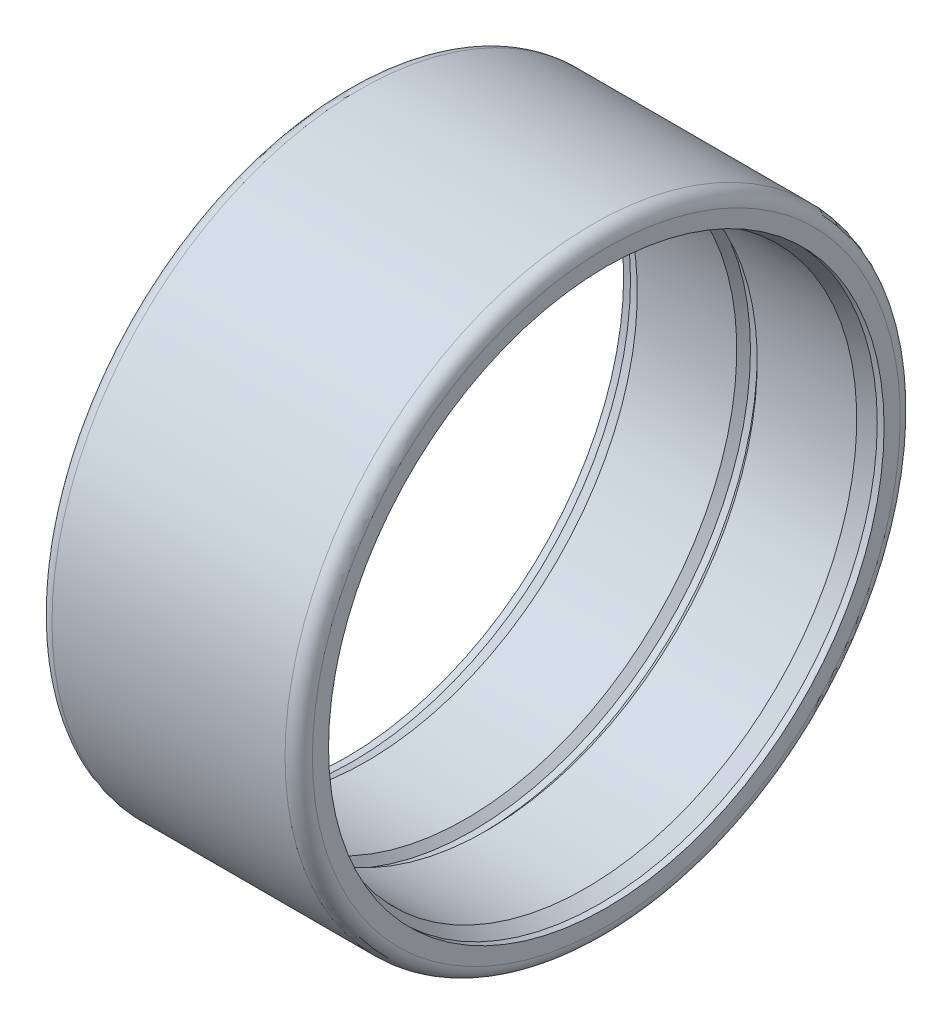
ISO-10303-21;
HEADER;
FILE_DESCRIPTION(('STEP AP214'),'2;1');
FILE_NAME('part.step','',(''),(''),'','','');
FILE_SCHEMA(('AUTOMOTIVE_DESIGN { 1 0 10303 214 1 1 1 1 }'));
ENDSEC;
DATA;
#1=APPLICATION_CONTEXT('core data for automotive mechanical design processes');
#2=APPLICATION_PROTOCOL_DEFINITION('international standard','automotive_design',2000,#1);
#3=PRODUCT_CONTEXT('',#1,'mechanical');
#4=PRODUCT('Part','Part','',(#3));
#5=PRODUCT_RELATED_PRODUCT_CATEGORY('part','',(#4));
#6=PRODUCT_DEFINITION_FORMATION('','',#4);
#7=PRODUCT_DEFINITION_CONTEXT('part definition',#1,'design');
#8=PRODUCT_DEFINITION('design','',#6,#7);
#9=PRODUCT_DEFINITION_SHAPE('','',#8);
#10=(LENGTH_UNIT() NAMED_UNIT(*) SI_UNIT(.MILLI.,.METRE.));
#11=(NAMED_UNIT(*) PLANE_ANGLE_UNIT() SI_UNIT($,.RADIAN.));
#12=(NAMED_UNIT(*) SI_UNIT($,.STERADIAN.) SOLID_ANGLE_UNIT());
#13=UNCERTAINTY_MEASURE_WITH_UNIT(LENGTH_MEASURE(1.E-05),#10,'distance_accuracy_value','');
#14=(GEOMETRIC_REPRESENTATION_CONTEXT(3) GLOBAL_UNCERTAINTY_ASSIGNED_CONTEXT((#13)) GLOBAL_UNIT_ASSIGNED_CONTEXT((#10,
#11,#12)) REPRESENTATION_CONTEXT('',''));
#15=CARTESIAN_POINT('',(0.,0.,0.));
#16=DIRECTION('',(0.,0.,1.));
#17=DIRECTION('',(1.,0.,0.));
#18=AXIS2_PLACEMENT_3D('',#15,#16,#17);
#19=CARTESIAN_POINT('',(-7.5,0.,0.));
#20=DIRECTION('',(1.,0.,0.));
#21=DIRECTION('',(0.,0.,-1.));
#22=AXIS2_PLACEMENT_3D('',#19,#20,#21);
#23=CONICAL_SURFACE('',#22,198.2,0.785398163397451);
#24=CARTESIAN_POINT('',(-2.5,0.,0.));
#25=DIRECTION('',(-1.,0.,0.));
#26=DIRECTION('',(0.,0.,1.));
#27=AXIS2_PLACEMENT_3D('',#24,#25,#26);
#28=CIRCLE('',#27,203.2);
#29=CARTESIAN_POINT('',(-2.5,0.,203.2));
#30=VERTEX_POINT('',#29);
#31=EDGE_CURVE('E51',#30,#30,#28,.T.);
#32=ORIENTED_EDGE('',*,*,#31,.F.);
#33=EDGE_LOOP('',(#32));
#34=FACE_BOUND('',#33,.T.);
#35=CARTESIAN_POINT('',(-7.5,0.,0.));
#36=DIRECTION('',(-1.,0.,0.));
#37=DIRECTION('',(0.,0.,1.));
#38=AXIS2_PLACEMENT_3D('',#35,#36,#37);
#39=CIRCLE('',#38,198.2);
#40=CARTESIAN_POINT('',(-7.5,0.,198.2));
#41=VERTEX_POINT('',#40);
#42=EDGE_CURVE('E78',#41,#41,#39,.T.);
#43=ORIENTED_EDGE('',*,*,#42,.T.);
#44=EDGE_LOOP('',(#43));
#45=FACE_BOUND('',#44,.T.);
#46=ADVANCED_FACE('F31',(#34,#45),#23,.F.);
#47=CARTESIAN_POINT('',(-32.3713117610305,0.,0.));
#48=DIRECTION('',(-1.,0.,0.));
#49=DIRECTION('',(0.,0.,1.));
#50=AXIS2_PLACEMENT_3D('',#47,#48,#49);
#51=CYLINDRICAL_SURFACE('',#50,203.2);
#52=CARTESIAN_POINT('',(2.5,0.,0.));
#53=DIRECTION('',(-1.,0.,0.));
#54=DIRECTION('',(0.,0.,1.));
#55=AXIS2_PLACEMENT_3D('',#52,#53,#54);
#56=CIRCLE('',#55,203.2);
#57=CARTESIAN_POINT('',(2.5,0.,203.2));
#58=VERTEX_POINT('',#57);
#59=EDGE_CURVE('E54',#58,#58,#56,.T.);
#60=ORIENTED_EDGE('',*,*,#59,.F.);
#61=EDGE_LOOP('',(#60));
#62=FACE_BOUND('',#61,.T.);
#63=ORIENTED_EDGE('',*,*,#31,.T.);
#64=EDGE_LOOP('',(#63));
#65=FACE_BOUND('',#64,.T.);
#66=ADVANCED_FACE('F113',(#62,#65),#51,.F.);
#67=CARTESIAN_POINT('',(2.5,0.,0.));
#68=DIRECTION('',(-1.,0.,0.));
#69=DIRECTION('',(0.,0.,1.));
#70=AXIS2_PLACEMENT_3D('',#67,#68,#69);
#71=CONICAL_SURFACE('',#70,203.2,0.785398163397451);
#72=CARTESIAN_POINT('',(7.50000000000001,0.,0.));
#73=DIRECTION('',(-1.,0.,0.));
#74=DIRECTION('',(0.,0.,1.));
#75=AXIS2_PLACEMENT_3D('',#72,#73,#74);
#76=CIRCLE('',#75,198.2);
#77=CARTESIAN_POINT('',(7.50000000000001,0.,198.2));
#78=VERTEX_POINT('',#77);
#79=EDGE_CURVE('E57',#78,#78,#76,.T.);
#80=ORIENTED_EDGE('',*,*,#79,.F.);
#81=EDGE_LOOP('',(#80));
#82=FACE_BOUND('',#81,.T.);
#83=ORIENTED_EDGE('',*,*,#59,.T.);
#84=EDGE_LOOP('',(#83));
#85=FACE_BOUND('',#84,.T.);
#86=ADVANCED_FACE('F119',(#82,#85),#71,.F.);
#87=CARTESIAN_POINT('',(-32.3713117610305,0.,0.));
#88=DIRECTION('',(-1.,0.,0.));
#89=DIRECTION('',(0.,0.,1.));
#90=AXIS2_PLACEMENT_3D('',#87,#88,#89);
#91=CYLINDRICAL_SURFACE('',#90,198.2);
#92=CARTESIAN_POINT('',(80.25,0.,0.));
#93=DIRECTION('',(-1.,0.,0.));
#94=DIRECTION('',(0.,0.,1.));
#95=AXIS2_PLACEMENT_3D('',#92,#93,#94);
#96=CIRCLE('',#95,198.2);
#97=CARTESIAN_POINT('',(80.25,0.,198.2));
#98=VERTEX_POINT('',#97);
#99=EDGE_CURVE('E60',#98,#98,#96,.T.);
#100=ORIENTED_EDGE('',*,*,#99,.F.);
#101=EDGE_LOOP('',(#100));
#102=FACE_BOUND('',#101,.T.);
#103=ORIENTED_EDGE('',*,*,#79,.T.);
#104=EDGE_LOOP('',(#103));
#105=FACE_BOUND('',#104,.T.);
#106=ADVANCED_FACE('F197',(#102,#105),#91,.F.);
#107=CARTESIAN_POINT('',(80.25,0.,0.));
#108=DIRECTION('',(1.,0.,0.));
#109=DIRECTION('',(0.,0.,-1.));
#110=AXIS2_PLACEMENT_3D('',#107,#108,#109);
#111=CONICAL_SURFACE('',#110,198.2,0.463647609000809);
#112=CARTESIAN_POINT('',(90.25,0.,0.));
#113=DIRECTION('',(-1.,0.,0.));
#114=DIRECTION('',(0.,0.,1.));
#115=AXIS2_PLACEMENT_3D('',#112,#113,#114);
#116=CIRCLE('',#115,203.2);
#117=CARTESIAN_POINT('',(90.25,0.,203.2));
#118=VERTEX_POINT('',#117);
#119=EDGE_CURVE('E63',#118,#118,#116,.T.);
#120=ORIENTED_EDGE('',*,*,#119,.F.);
#121=EDGE_LOOP('',(#120));
#122=FACE_BOUND('',#121,.T.);
#123=ORIENTED_EDGE('',*,*,#99,.T.);
#124=EDGE_LOOP('',(#123));
#125=FACE_BOUND('',#124,.T.);
#126=ADVANCED_FACE('F187',(#122,#125),#111,.F.);
#127=CARTESIAN_POINT('',(-32.3713117610305,0.,0.));
#128=DIRECTION('',(-1.,0.,0.));
#129=DIRECTION('',(0.,0.,1.));
#130=AXIS2_PLACEMENT_3D('',#127,#128,#129);
#131=CYLINDRICAL_SURFACE('',#130,203.2);
#132=CARTESIAN_POINT('',(95.25,0.,0.));
#133=DIRECTION('',(-1.,0.,0.));
#134=DIRECTION('',(0.,0.,1.));
#135=AXIS2_PLACEMENT_3D('',#132,#133,#134);
#136=CIRCLE('',#135,203.2);
#137=CARTESIAN_POINT('',(95.25,0.,203.2));
#138=VERTEX_POINT('',#137);
#139=EDGE_CURVE('E66',#138,#138,#136,.T.);
#140=ORIENTED_EDGE('',*,*,#139,.F.);
#141=EDGE_LOOP('',(#140));
#142=FACE_BOUND('',#141,.T.);
#143=ORIENTED_EDGE('',*,*,#119,.T.);
#144=EDGE_LOOP('',(#143));
#145=FACE_BOUND('',#144,.T.);
#146=ADVANCED_FACE('F162',(#142,#145),#131,.F.);
#147=CARTESIAN_POINT('',(95.25,203.2,0.));
#148=DIRECTION('',(-1.,0.,0.));
#149=DIRECTION('',(0.,0.,1.));
#150=AXIS2_PLACEMENT_3D('',#147,#148,#149);
#151=PLANE('',#150);
#152=CARTESIAN_POINT('',(95.25,0.,0.));
#153=DIRECTION('',(-1.,0.,0.));
#154=DIRECTION('',(0.,0.,1.));
#155=AXIS2_PLACEMENT_3D('',#152,#153,#154);
#156=CIRCLE('',#155,215.);
#157=CARTESIAN_POINT('',(95.25,0.,215.));
#158=VERTEX_POINT('',#157);
#159=EDGE_CURVE('E38',#158,#158,#156,.F.);
#160=ORIENTED_EDGE('',*,*,#159,.T.);
#161=EDGE_LOOP('',(#160));
#162=FACE_BOUND('',#161,.T.);
#163=ORIENTED_EDGE('',*,*,#139,.T.);
#164=EDGE_LOOP('',(#163));
#165=FACE_BOUND('',#164,.T.);
#166=ADVANCED_FACE('F109',(#162,#165),#151,.F.);
#167=CARTESIAN_POINT('',(-32.3713117610305,0.,0.));
#168=DIRECTION('',(-1.,0.,0.));
#169=DIRECTION('',(0.,0.,1.));
#170=AXIS2_PLACEMENT_3D('',#167,#168,#169);
#171=CYLINDRICAL_SURFACE('',#170,225.);
#172=CARTESIAN_POINT('',(85.25,0.,0.));
#173=DIRECTION('',(-1.,0.,0.));
#174=DIRECTION('',(0.,0.,1.));
#175=AXIS2_PLACEMENT_3D('',#172,#173,#174);
#176=CIRCLE('',#175,225.);
#177=CARTESIAN_POINT('',(85.25,0.,225.));
#178=VERTEX_POINT('',#177);
#179=EDGE_CURVE('E42',#178,#178,#176,.T.);
#180=ORIENTED_EDGE('',*,*,#179,.T.);
#181=EDGE_LOOP('',(#180));
#182=FACE_BOUND('',#181,.T.);
#183=CARTESIAN_POINT('',(-85.25,0.,0.));
#184=DIRECTION('',(1.,0.,0.));
#185=DIRECTION('',(0.,0.,-1.));
#186=AXIS2_PLACEMENT_3D('',#183,#184,#185);
#187=CIRCLE('',#186,225.);
#188=CARTESIAN_POINT('',(-85.25,0.,-225.));
#189=VERTEX_POINT('',#188);
#190=EDGE_CURVE('E46',#189,#189,#187,.T.);
#191=ORIENTED_EDGE('',*,*,#190,.T.);
#192=EDGE_LOOP('',(#191));
#193=FACE_BOUND('',#192,.T.);
#194=ADVANCED_FACE('F104',(#182,#193),#171,.T.);
#195=CARTESIAN_POINT('',(-95.25,203.2,0.));
#196=DIRECTION('',(1.,0.,0.));
#197=DIRECTION('',(0.,0.,-1.));
#198=AXIS2_PLACEMENT_3D('',#195,#196,#197);
#199=PLANE('',#198);
#200=CARTESIAN_POINT('',(-95.25,0.,0.));
#201=DIRECTION('',(1.,0.,0.));
#202=DIRECTION('',(0.,0.,-1.));
#203=AXIS2_PLACEMENT_3D('',#200,#201,#202);
#204=CIRCLE('',#203,215.);
#205=CARTESIAN_POINT('',(-95.25,0.,-215.));
#206=VERTEX_POINT('',#205);
#207=EDGE_CURVE('E10',#206,#206,#204,.F.);
#208=ORIENTED_EDGE('',*,*,#207,.T.);
#209=EDGE_LOOP('',(#208));
#210=FACE_BOUND('',#209,.T.);
#211=CARTESIAN_POINT('',(-95.25,0.,0.));
#212=DIRECTION('',(-1.,0.,0.));
#213=DIRECTION('',(0.,0.,1.));
#214=AXIS2_PLACEMENT_3D('',#211,#212,#213);
#215=CIRCLE('',#214,203.2);
#216=CARTESIAN_POINT('',(-95.25,0.,203.2));
#217=VERTEX_POINT('',#216);
#218=EDGE_CURVE('E69',#217,#217,#215,.T.);
#219=ORIENTED_EDGE('',*,*,#218,.F.);
#220=EDGE_LOOP('',(#219));
#221=FACE_BOUND('',#220,.T.);
#222=ADVANCED_FACE('F99',(#210,#221),#199,.F.);
#223=CARTESIAN_POINT('',(-32.3713117610305,0.,0.));
#224=DIRECTION('',(-1.,0.,0.));
#225=DIRECTION('',(0.,0.,1.));
#226=AXIS2_PLACEMENT_3D('',#223,#224,#225);
#227=CYLINDRICAL_SURFACE('',#226,203.2);
#228=CARTESIAN_POINT('',(-90.25,0.,0.));
#229=DIRECTION('',(-1.,0.,0.));
#230=DIRECTION('',(0.,0.,1.));
#231=AXIS2_PLACEMENT_3D('',#228,#229,#230);
#232=CIRCLE('',#231,203.2);
#233=CARTESIAN_POINT('',(-90.25,0.,203.2));
#234=VERTEX_POINT('',#233);
#235=EDGE_CURVE('E72',#234,#234,#232,.T.);
#236=ORIENTED_EDGE('',*,*,#235,.F.);
#237=EDGE_LOOP('',(#236));
#238=FACE_BOUND('',#237,.T.);
#239=ORIENTED_EDGE('',*,*,#218,.T.);
#240=EDGE_LOOP('',(#239));
#241=FACE_BOUND('',#240,.T.);
#242=ADVANCED_FACE('F93',(#238,#241),#227,.F.);
#243=CARTESIAN_POINT('',(-90.25,0.,0.));
#244=DIRECTION('',(-1.,0.,0.));
#245=DIRECTION('',(0.,0.,1.));
#246=AXIS2_PLACEMENT_3D('',#243,#244,#245);
#247=CONICAL_SURFACE('',#246,203.2,0.463647609000809);
#248=CARTESIAN_POINT('',(-80.25,0.,0.));
#249=DIRECTION('',(-1.,0.,0.));
#250=DIRECTION('',(0.,0.,1.));
#251=AXIS2_PLACEMENT_3D('',#248,#249,#250);
#252=CIRCLE('',#251,198.2);
#253=CARTESIAN_POINT('',(-80.25,0.,198.2));
#254=VERTEX_POINT('',#253);
#255=EDGE_CURVE('E75',#254,#254,#252,.T.);
#256=ORIENTED_EDGE('',*,*,#255,.F.);
#257=EDGE_LOOP('',(#256));
#258=FACE_BOUND('',#257,.T.);
#259=ORIENTED_EDGE('',*,*,#235,.T.);
#260=EDGE_LOOP('',(#259));
#261=FACE_BOUND('',#260,.T.);
#262=ADVANCED_FACE('F87',(#258,#261),#247,.F.);
#263=CARTESIAN_POINT('',(-32.3713117610305,0.,0.));
#264=DIRECTION('',(-1.,0.,0.));
#265=DIRECTION('',(0.,0.,1.));
#266=AXIS2_PLACEMENT_3D('',#263,#264,#265);
#267=CYLINDRICAL_SURFACE('',#266,198.2);
#268=ORIENTED_EDGE('',*,*,#42,.F.);
#269=EDGE_LOOP('',(#268));
#270=FACE_BOUND('',#269,.T.);
#271=ORIENTED_EDGE('',*,*,#255,.T.);
#272=EDGE_LOOP('',(#271));
#273=FACE_BOUND('',#272,.T.);
#274=ADVANCED_FACE('F83',(#270,#273),#267,.F.);
#275=CARTESIAN_POINT('',(85.25,0.,0.));
#276=DIRECTION('',(-1.,0.,0.));
#277=DIRECTION('',(0.,0.,1.));
#278=AXIS2_PLACEMENT_3D('',#275,#276,#277);
#279=TOROIDAL_SURFACE('',#278,215.,10.);
#280=ORIENTED_EDGE('',*,*,#159,.F.);
#281=EDGE_LOOP('',(#280));
#282=FACE_BOUND('',#281,.T.);
#283=ORIENTED_EDGE('',*,*,#179,.F.);
#284=EDGE_LOOP('',(#283));
#285=FACE_BOUND('',#284,.T.);
#286=ADVANCED_FACE('F86',(#282,#285),#279,.T.);
#287=CARTESIAN_POINT('',(-85.25,0.,0.));
#288=DIRECTION('',(1.,0.,0.));
#289=DIRECTION('',(0.,0.,-1.));
#290=AXIS2_PLACEMENT_3D('',#287,#288,#289);
#291=TOROIDAL_SURFACE('',#290,215.,10.);
#292=ORIENTED_EDGE('',*,*,#190,.F.);
#293=EDGE_LOOP('',(#292));
#294=FACE_BOUND('',#293,.T.);
#295=ORIENTED_EDGE('',*,*,#207,.F.);
#296=EDGE_LOOP('',(#295));
#297=FACE_BOUND('',#296,.T.);
#298=ADVANCED_FACE('F33',(#294,#297),#291,.T.);
#299=CLOSED_SHELL('',(#46,#66,#86,#106,#126,#146,#166,#194,#222,#242,#262,#274,#286,#298));
#300=MANIFOLD_SOLID_BREP('B2',#299);
#301=ADVANCED_BREP_SHAPE_REPRESENTATION('',(#18,#300),#14);
#302=SHAPE_DEFINITION_REPRESENTATION(#9,#301);
ENDSEC;
END-ISO-10303-21;
